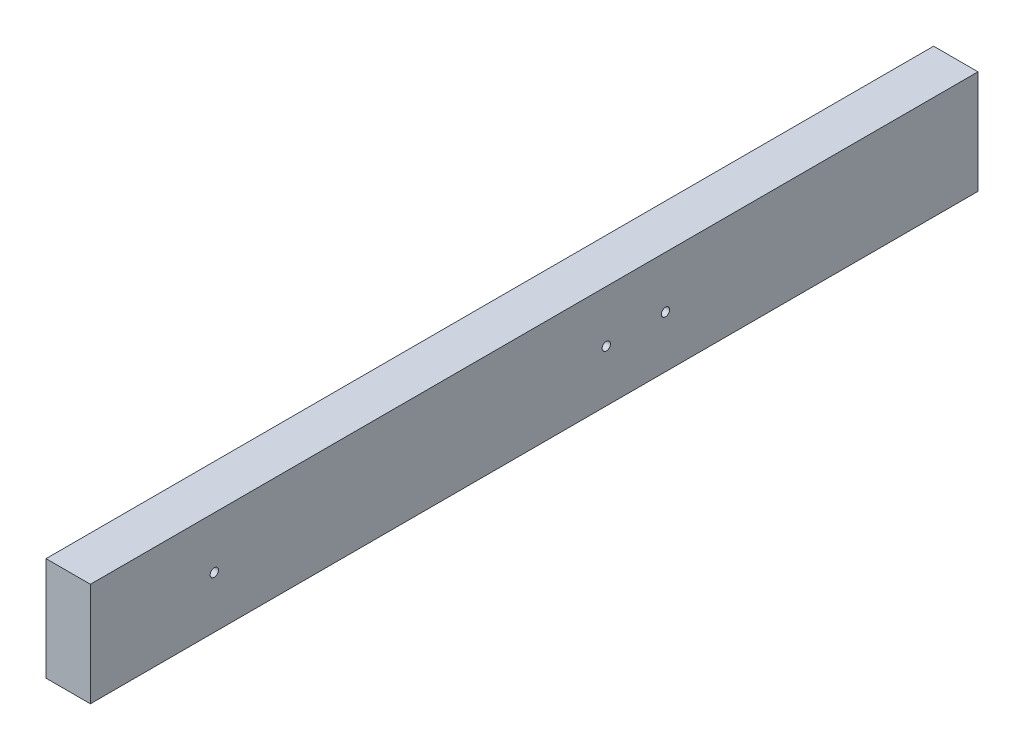
ISO-10303-21;
HEADER;
FILE_DESCRIPTION(('STEP AP214'),'2;1');
FILE_NAME('part.step','',(''),(''),'','','');
FILE_SCHEMA(('AUTOMOTIVE_DESIGN { 1 0 10303 214 1 1 1 1 }'));
ENDSEC;
DATA;
#1=APPLICATION_CONTEXT('core data for automotive mechanical design processes');
#2=APPLICATION_PROTOCOL_DEFINITION('international standard','automotive_design',2000,#1);
#3=PRODUCT_CONTEXT('',#1,'mechanical');
#4=PRODUCT('Part','Part','',(#3));
#5=PRODUCT_RELATED_PRODUCT_CATEGORY('part','',(#4));
#6=PRODUCT_DEFINITION_FORMATION('','',#4);
#7=PRODUCT_DEFINITION_CONTEXT('part definition',#1,'design');
#8=PRODUCT_DEFINITION('design','',#6,#7);
#9=PRODUCT_DEFINITION_SHAPE('','',#8);
#10=(LENGTH_UNIT() NAMED_UNIT(*) SI_UNIT(.MILLI.,.METRE.));
#11=(NAMED_UNIT(*) PLANE_ANGLE_UNIT() SI_UNIT($,.RADIAN.));
#12=(NAMED_UNIT(*) SI_UNIT($,.STERADIAN.) SOLID_ANGLE_UNIT());
#13=UNCERTAINTY_MEASURE_WITH_UNIT(LENGTH_MEASURE(1.E-05),#10,'distance_accuracy_value','');
#14=(GEOMETRIC_REPRESENTATION_CONTEXT(3) GLOBAL_UNCERTAINTY_ASSIGNED_CONTEXT((#13)) GLOBAL_UNIT_ASSIGNED_CONTEXT((#10,
#11,#12)) REPRESENTATION_CONTEXT('',''));
#15=CARTESIAN_POINT('',(0.,0.,0.));
#16=DIRECTION('',(0.,0.,1.));
#17=DIRECTION('',(1.,0.,0.));
#18=AXIS2_PLACEMENT_3D('',#15,#16,#17);
#19=CARTESIAN_POINT('',(38.1,0.,0.));
#20=DIRECTION('',(0.,0.,-1.));
#21=DIRECTION('',(-1.,0.,0.));
#22=AXIS2_PLACEMENT_3D('',#19,#20,#21);
#23=PLANE('',#22);
#24=DIRECTION('',(0.,-1.,0.));
#25=VECTOR('',#24,1.);
#26=CARTESIAN_POINT('',(0.,0.,0.));
#27=LINE('',#26,#25);
#28=CARTESIAN_POINT('',(0.,88.9,0.));
#29=VERTEX_POINT('',#28);
#30=CARTESIAN_POINT('',(0.,0.,0.));
#31=VERTEX_POINT('',#30);
#32=EDGE_CURVE('E95',#29,#31,#27,.T.);
#33=ORIENTED_EDGE('',*,*,#32,.T.);
#34=DIRECTION('',(-1.,0.,0.));
#35=VECTOR('',#34,1.);
#36=CARTESIAN_POINT('',(38.1,0.,0.));
#37=LINE('',#36,#35);
#38=CARTESIAN_POINT('',(38.1,0.,0.));
#39=VERTEX_POINT('',#38);
#40=EDGE_CURVE('E11',#39,#31,#37,.T.);
#41=ORIENTED_EDGE('',*,*,#40,.F.);
#42=DIRECTION('',(0.,-1.,0.));
#43=VECTOR('',#42,1.);
#44=CARTESIAN_POINT('',(38.1,0.,0.));
#45=LINE('',#44,#43);
#46=CARTESIAN_POINT('',(38.1,88.9,0.));
#47=VERTEX_POINT('',#46);
#48=EDGE_CURVE('E83',#47,#39,#45,.T.);
#49=ORIENTED_EDGE('',*,*,#48,.F.);
#50=DIRECTION('',(-1.,0.,0.));
#51=VECTOR('',#50,1.);
#52=CARTESIAN_POINT('',(38.1,88.9,0.));
#53=LINE('',#52,#51);
#54=EDGE_CURVE('E91',#47,#29,#53,.T.);
#55=ORIENTED_EDGE('',*,*,#54,.T.);
#56=EDGE_LOOP('',(#33,#41,#49,#55));
#57=FACE_BOUND('',#56,.T.);
#58=ADVANCED_FACE('F32',(#57),#23,.F.);
#59=CARTESIAN_POINT('',(38.1,0.,0.));
#60=DIRECTION('',(0.,1.,0.));
#61=DIRECTION('',(0.,0.,1.));
#62=AXIS2_PLACEMENT_3D('',#59,#60,#61);
#63=PLANE('',#62);
#64=DIRECTION('',(0.,0.,-1.));
#65=VECTOR('',#64,1.);
#66=CARTESIAN_POINT('',(0.,0.,0.));
#67=LINE('',#66,#65);
#68=CARTESIAN_POINT('',(0.,0.,-762.));
#69=VERTEX_POINT('',#68);
#70=EDGE_CURVE('E87',#31,#69,#67,.T.);
#71=ORIENTED_EDGE('',*,*,#70,.T.);
#72=DIRECTION('',(-1.,0.,0.));
#73=VECTOR('',#72,1.);
#74=CARTESIAN_POINT('',(38.1,0.,-762.));
#75=LINE('',#74,#73);
#76=CARTESIAN_POINT('',(38.1,0.,-762.));
#77=VERTEX_POINT('',#76);
#78=EDGE_CURVE('E40',#77,#69,#75,.T.);
#79=ORIENTED_EDGE('',*,*,#78,.F.);
#80=DIRECTION('',(0.,0.,-1.));
#81=VECTOR('',#80,1.);
#82=CARTESIAN_POINT('',(38.1,0.,0.));
#83=LINE('',#82,#81);
#84=EDGE_CURVE('E78',#39,#77,#83,.T.);
#85=ORIENTED_EDGE('',*,*,#84,.F.);
#86=ORIENTED_EDGE('',*,*,#40,.T.);
#87=EDGE_LOOP('',(#71,#79,#85,#86));
#88=FACE_BOUND('',#87,.T.);
#89=ADVANCED_FACE('F86',(#88),#63,.F.);
#90=CARTESIAN_POINT('',(38.1,0.,-762.));
#91=DIRECTION('',(0.,0.,1.));
#92=DIRECTION('',(1.,0.,0.));
#93=AXIS2_PLACEMENT_3D('',#90,#91,#92);
#94=PLANE('',#93);
#95=DIRECTION('',(0.,1.,0.));
#96=VECTOR('',#95,1.);
#97=CARTESIAN_POINT('',(0.,0.,-762.));
#98=LINE('',#97,#96);
#99=CARTESIAN_POINT('',(0.,88.9,-762.));
#100=VERTEX_POINT('',#99);
#101=EDGE_CURVE('E65',#69,#100,#98,.T.);
#102=ORIENTED_EDGE('',*,*,#101,.T.);
#103=DIRECTION('',(-1.,0.,0.));
#104=VECTOR('',#103,1.);
#105=CARTESIAN_POINT('',(38.1,88.9,-762.));
#106=LINE('',#105,#104);
#107=CARTESIAN_POINT('',(38.1,88.9,-762.));
#108=VERTEX_POINT('',#107);
#109=EDGE_CURVE('E88',#108,#100,#106,.T.);
#110=ORIENTED_EDGE('',*,*,#109,.F.);
#111=DIRECTION('',(0.,1.,0.));
#112=VECTOR('',#111,1.);
#113=CARTESIAN_POINT('',(38.1,0.,-762.));
#114=LINE('',#113,#112);
#115=EDGE_CURVE('E81',#77,#108,#114,.T.);
#116=ORIENTED_EDGE('',*,*,#115,.F.);
#117=ORIENTED_EDGE('',*,*,#78,.T.);
#118=EDGE_LOOP('',(#102,#110,#116,#117));
#119=FACE_BOUND('',#118,.T.);
#120=ADVANCED_FACE('F89',(#119),#94,.F.);
#121=CARTESIAN_POINT('',(38.1,88.9,0.));
#122=DIRECTION('',(0.,-1.,0.));
#123=DIRECTION('',(0.,0.,-1.));
#124=AXIS2_PLACEMENT_3D('',#121,#122,#123);
#125=PLANE('',#124);
#126=DIRECTION('',(0.,0.,1.));
#127=VECTOR('',#126,1.);
#128=CARTESIAN_POINT('',(0.,88.9,0.));
#129=LINE('',#128,#127);
#130=EDGE_CURVE('E71',#100,#29,#129,.T.);
#131=ORIENTED_EDGE('',*,*,#130,.T.);
#132=ORIENTED_EDGE('',*,*,#54,.F.);
#133=DIRECTION('',(0.,0.,1.));
#134=VECTOR('',#133,1.);
#135=CARTESIAN_POINT('',(38.1,88.9,0.));
#136=LINE('',#135,#134);
#137=EDGE_CURVE('E48',#108,#47,#136,.T.);
#138=ORIENTED_EDGE('',*,*,#137,.F.);
#139=ORIENTED_EDGE('',*,*,#109,.T.);
#140=EDGE_LOOP('',(#131,#132,#138,#139));
#141=FACE_BOUND('',#140,.T.);
#142=ADVANCED_FACE('F103',(#141),#125,.F.);
#143=CARTESIAN_POINT('',(38.1,0.,0.));
#144=DIRECTION('',(-1.,0.,0.));
#145=DIRECTION('',(0.,0.,1.));
#146=AXIS2_PLACEMENT_3D('',#143,#144,#145);
#147=PLANE('',#146);
#148=CARTESIAN_POINT('',(38.1,44.45,-106.39298));
#149=DIRECTION('',(1.,0.,0.));
#150=DIRECTION('',(0.,0.,-1.));
#151=AXIS2_PLACEMENT_3D('',#148,#149,#150);
#152=CIRCLE('',#151,3.57187500000001);
#153=CARTESIAN_POINT('',(38.1,44.45,-109.964855));
#154=VERTEX_POINT('',#153);
#155=EDGE_CURVE('E121',#154,#154,#152,.T.);
#156=ORIENTED_EDGE('',*,*,#155,.F.);
#157=EDGE_LOOP('',(#156));
#158=FACE_BOUND('',#157,.T.);
#159=CARTESIAN_POINT('',(38.1,44.45,-442.9125));
#160=DIRECTION('',(1.,0.,0.));
#161=DIRECTION('',(0.,0.,-1.));
#162=AXIS2_PLACEMENT_3D('',#159,#160,#161);
#163=CIRCLE('',#162,3.57187499999998);
#164=CARTESIAN_POINT('',(38.1,44.45,-446.484375));
#165=VERTEX_POINT('',#164);
#166=EDGE_CURVE('E115',#165,#165,#163,.T.);
#167=ORIENTED_EDGE('',*,*,#166,.F.);
#168=EDGE_LOOP('',(#167));
#169=FACE_BOUND('',#168,.T.);
#170=CARTESIAN_POINT('',(38.1,44.45,-493.7125));
#171=DIRECTION('',(1.,0.,0.));
#172=DIRECTION('',(0.,0.,-1.));
#173=AXIS2_PLACEMENT_3D('',#170,#171,#172);
#174=CIRCLE('',#173,3.57187499999998);
#175=CARTESIAN_POINT('',(38.1,44.45,-497.284375));
#176=VERTEX_POINT('',#175);
#177=EDGE_CURVE('E109',#176,#176,#174,.T.);
#178=ORIENTED_EDGE('',*,*,#177,.F.);
#179=EDGE_LOOP('',(#178));
#180=FACE_BOUND('',#179,.T.);
#181=ORIENTED_EDGE('',*,*,#48,.T.);
#182=ORIENTED_EDGE('',*,*,#84,.T.);
#183=ORIENTED_EDGE('',*,*,#115,.T.);
#184=ORIENTED_EDGE('',*,*,#137,.T.);
#185=EDGE_LOOP('',(#181,#182,#183,#184));
#186=FACE_BOUND('',#185,.T.);
#187=ADVANCED_FACE('F79',(#158,#169,#180,#186),#147,.F.);
#188=CARTESIAN_POINT('',(0.,0.,0.));
#189=DIRECTION('',(-1.,0.,0.));
#190=DIRECTION('',(0.,0.,1.));
#191=AXIS2_PLACEMENT_3D('',#188,#189,#190);
#192=PLANE('',#191);
#193=CARTESIAN_POINT('',(0.,44.45,-106.39298));
#194=DIRECTION('',(1.,0.,0.));
#195=DIRECTION('',(0.,0.,-1.));
#196=AXIS2_PLACEMENT_3D('',#193,#194,#195);
#197=CIRCLE('',#196,3.57187500000001);
#198=CARTESIAN_POINT('',(0.,44.45,-109.964855));
#199=VERTEX_POINT('',#198);
#200=EDGE_CURVE('E98',#199,#199,#197,.T.);
#201=ORIENTED_EDGE('',*,*,#200,.T.);
#202=EDGE_LOOP('',(#201));
#203=FACE_BOUND('',#202,.T.);
#204=CARTESIAN_POINT('',(0.,44.45,-442.9125));
#205=DIRECTION('',(1.,0.,0.));
#206=DIRECTION('',(0.,0.,-1.));
#207=AXIS2_PLACEMENT_3D('',#204,#205,#206);
#208=CIRCLE('',#207,3.57187499999998);
#209=CARTESIAN_POINT('',(0.,44.45,-446.484375));
#210=VERTEX_POINT('',#209);
#211=EDGE_CURVE('E118',#210,#210,#208,.T.);
#212=ORIENTED_EDGE('',*,*,#211,.T.);
#213=EDGE_LOOP('',(#212));
#214=FACE_BOUND('',#213,.T.);
#215=CARTESIAN_POINT('',(0.,44.45,-493.7125));
#216=DIRECTION('',(1.,0.,0.));
#217=DIRECTION('',(0.,0.,-1.));
#218=AXIS2_PLACEMENT_3D('',#215,#216,#217);
#219=CIRCLE('',#218,3.57187499999998);
#220=CARTESIAN_POINT('',(0.,44.45,-497.284375));
#221=VERTEX_POINT('',#220);
#222=EDGE_CURVE('E112',#221,#221,#219,.T.);
#223=ORIENTED_EDGE('',*,*,#222,.T.);
#224=EDGE_LOOP('',(#223));
#225=FACE_BOUND('',#224,.T.);
#226=ORIENTED_EDGE('',*,*,#32,.F.);
#227=ORIENTED_EDGE('',*,*,#130,.F.);
#228=ORIENTED_EDGE('',*,*,#101,.F.);
#229=ORIENTED_EDGE('',*,*,#70,.F.);
#230=EDGE_LOOP('',(#226,#227,#228,#229));
#231=FACE_BOUND('',#230,.T.);
#232=ADVANCED_FACE('F106',(#203,#214,#225,#231),#192,.T.);
#233=CARTESIAN_POINT('',(0.,44.45,-493.7125));
#234=DIRECTION('',(1.,0.,0.));
#235=DIRECTION('',(0.,0.,-1.));
#236=AXIS2_PLACEMENT_3D('',#233,#234,#235);
#237=CYLINDRICAL_SURFACE('',#236,3.57187499999998);
#238=CARTESIAN_POINT('',(0.,44.45,-497.284375));
#239=CARTESIAN_POINT('',(0.396875,44.45,-497.284375));
#240=CARTESIAN_POINT('',(0.79375,44.45,-497.284375));
#241=CARTESIAN_POINT('',(1.5875,44.45,-497.284375));
#242=CARTESIAN_POINT('',(1.984375,44.45,-497.284375));
#243=CARTESIAN_POINT('',(2.778125,44.45,-497.284375));
#244=CARTESIAN_POINT('',(3.175,44.45,-497.284375));
#245=CARTESIAN_POINT('',(3.96875,44.45,-497.284375));
#246=CARTESIAN_POINT('',(4.365625,44.45,-497.284375));
#247=CARTESIAN_POINT('',(5.159375,44.45,-497.284375));
#248=CARTESIAN_POINT('',(5.55625,44.45,-497.284375));
#249=CARTESIAN_POINT('',(6.35,44.45,-497.284375));
#250=CARTESIAN_POINT('',(6.746875,44.45,-497.284375));
#251=CARTESIAN_POINT('',(7.540625,44.45,-497.284375));
#252=CARTESIAN_POINT('',(7.9375,44.45,-497.284375));
#253=CARTESIAN_POINT('',(8.73125,44.45,-497.284375));
#254=CARTESIAN_POINT('',(9.128125,44.45,-497.284375));
#255=CARTESIAN_POINT('',(9.921875,44.45,-497.284375));
#256=CARTESIAN_POINT('',(10.31875,44.45,-497.284375));
#257=CARTESIAN_POINT('',(11.1125,44.45,-497.284375));
#258=CARTESIAN_POINT('',(11.509375,44.45,-497.284375));
#259=CARTESIAN_POINT('',(12.303125,44.45,-497.284375));
#260=CARTESIAN_POINT('',(12.7,44.45,-497.284375));
#261=CARTESIAN_POINT('',(13.49375,44.45,-497.284375));
#262=CARTESIAN_POINT('',(13.890625,44.45,-497.284375));
#263=CARTESIAN_POINT('',(14.684375,44.45,-497.284375));
#264=CARTESIAN_POINT('',(15.08125,44.45,-497.284375));
#265=CARTESIAN_POINT('',(15.875,44.45,-497.284375));
#266=CARTESIAN_POINT('',(16.271875,44.45,-497.284375));
#267=CARTESIAN_POINT('',(17.065625,44.45,-497.284375));
#268=CARTESIAN_POINT('',(17.4625,44.45,-497.284375));
#269=CARTESIAN_POINT('',(18.25625,44.45,-497.284375));
#270=CARTESIAN_POINT('',(18.653125,44.45,-497.284375));
#271=CARTESIAN_POINT('',(19.446875,44.45,-497.284375));
#272=CARTESIAN_POINT('',(19.84375,44.45,-497.284375));
#273=CARTESIAN_POINT('',(20.6375,44.45,-497.284375));
#274=CARTESIAN_POINT('',(21.034375,44.45,-497.284375));
#275=CARTESIAN_POINT('',(21.828125,44.45,-497.284375));
#276=CARTESIAN_POINT('',(22.225,44.45,-497.284375));
#277=CARTESIAN_POINT('',(23.01875,44.45,-497.284375));
#278=CARTESIAN_POINT('',(23.415625,44.45,-497.284375));
#279=CARTESIAN_POINT('',(24.209375,44.45,-497.284375));
#280=CARTESIAN_POINT('',(24.60625,44.45,-497.284375));
#281=CARTESIAN_POINT('',(25.4,44.45,-497.284375));
#282=CARTESIAN_POINT('',(25.796875,44.45,-497.284375));
#283=CARTESIAN_POINT('',(26.590625,44.45,-497.284375));
#284=CARTESIAN_POINT('',(26.9875,44.45,-497.284375));
#285=CARTESIAN_POINT('',(27.78125,44.45,-497.284375));
#286=CARTESIAN_POINT('',(28.178125,44.45,-497.284375));
#287=CARTESIAN_POINT('',(28.971875,44.45,-497.284375));
#288=CARTESIAN_POINT('',(29.36875,44.45,-497.284375));
#289=CARTESIAN_POINT('',(30.1625,44.45,-497.284375));
#290=CARTESIAN_POINT('',(30.559375,44.45,-497.284375));
#291=CARTESIAN_POINT('',(31.353125,44.45,-497.284375));
#292=CARTESIAN_POINT('',(31.75,44.45,-497.284375));
#293=CARTESIAN_POINT('',(32.54375,44.45,-497.284375));
#294=CARTESIAN_POINT('',(32.940625,44.45,-497.284375));
#295=CARTESIAN_POINT('',(33.734375,44.45,-497.284375));
#296=CARTESIAN_POINT('',(34.13125,44.45,-497.284375));
#297=CARTESIAN_POINT('',(34.925,44.45,-497.284375));
#298=CARTESIAN_POINT('',(35.321875,44.45,-497.284375));
#299=CARTESIAN_POINT('',(36.115625,44.45,-497.284375));
#300=CARTESIAN_POINT('',(36.5125,44.45,-497.284375));
#301=CARTESIAN_POINT('',(37.30625,44.45,-497.284375));
#302=CARTESIAN_POINT('',(37.703125,44.45,-497.284375));
#303=CARTESIAN_POINT('',(38.1,44.45,-497.284375));
#304=B_SPLINE_CURVE_WITH_KNOTS('',3,(#238,#239,#240,#241,#242,#243,#244,#245,#246,#247,#248,
#249,#250,#251,#252,#253,#254,#255,#256,#257,#258,#259,#260,#261,#262,#263,#264,#265,#266,#267,
#268,#269,#270,#271,#272,#273,#274,#275,#276,#277,#278,#279,#280,#281,#282,#283,#284,#285,#286,
#287,#288,#289,#290,#291,#292,#293,#294,#295,#296,#297,#298,#299,#300,#301,#302,#303),
.UNSPECIFIED.,.F.,.F.,(4,2,2,2,2,2,2,2,2,2,2,2,2,2,2,2,2,2,2,2,2,2,2,2,2,2,2,2,2,2,2,2,4),(0.,
1.190625,2.38125,3.571875,4.7625,5.953125,7.14375,8.334375,9.525,10.715625,11.90625,13.096875,
14.2875,15.478125,16.66875,17.859375,19.05,20.240625,21.43125,22.621875,23.8125,25.003125,
26.19375,27.384375,28.575,29.765625,30.95625,32.146875,33.3375,34.528125,35.71875,36.909375,
38.1),.UNSPECIFIED.);
#305=EDGE_CURVE('BSEAM143',#221,#176,#304,.T.);
#306=ORIENTED_EDGE('',*,*,#222,.F.);
#307=ORIENTED_EDGE('',*,*,#177,.T.);
#308=ORIENTED_EDGE('',*,*,#305,.T.);
#309=ORIENTED_EDGE('',*,*,#305,.F.);
#310=EDGE_LOOP('',(#306,#308,#307,#309));
#311=FACE_BOUND('',#310,.T.);
#312=ADVANCED_FACE('F143',(#311),#237,.F.);
#313=CARTESIAN_POINT('',(0.,44.45,-442.9125));
#314=DIRECTION('',(1.,0.,0.));
#315=DIRECTION('',(0.,0.,-1.));
#316=AXIS2_PLACEMENT_3D('',#313,#314,#315);
#317=CYLINDRICAL_SURFACE('',#316,3.57187499999998);
#318=CARTESIAN_POINT('',(0.,44.45,-446.484375));
#319=CARTESIAN_POINT('',(0.396875,44.45,-446.484375));
#320=CARTESIAN_POINT('',(0.79375,44.45,-446.484375));
#321=CARTESIAN_POINT('',(1.5875,44.45,-446.484375));
#322=CARTESIAN_POINT('',(1.984375,44.45,-446.484375));
#323=CARTESIAN_POINT('',(2.778125,44.45,-446.484375));
#324=CARTESIAN_POINT('',(3.175,44.45,-446.484375));
#325=CARTESIAN_POINT('',(3.96875,44.45,-446.484375));
#326=CARTESIAN_POINT('',(4.365625,44.45,-446.484375));
#327=CARTESIAN_POINT('',(5.159375,44.45,-446.484375));
#328=CARTESIAN_POINT('',(5.55625,44.45,-446.484375));
#329=CARTESIAN_POINT('',(6.35,44.45,-446.484375));
#330=CARTESIAN_POINT('',(6.746875,44.45,-446.484375));
#331=CARTESIAN_POINT('',(7.540625,44.45,-446.484375));
#332=CARTESIAN_POINT('',(7.9375,44.45,-446.484375));
#333=CARTESIAN_POINT('',(8.73125,44.45,-446.484375));
#334=CARTESIAN_POINT('',(9.128125,44.45,-446.484375));
#335=CARTESIAN_POINT('',(9.921875,44.45,-446.484375));
#336=CARTESIAN_POINT('',(10.31875,44.45,-446.484375));
#337=CARTESIAN_POINT('',(11.1125,44.45,-446.484375));
#338=CARTESIAN_POINT('',(11.509375,44.45,-446.484375));
#339=CARTESIAN_POINT('',(12.303125,44.45,-446.484375));
#340=CARTESIAN_POINT('',(12.7,44.45,-446.484375));
#341=CARTESIAN_POINT('',(13.49375,44.45,-446.484375));
#342=CARTESIAN_POINT('',(13.890625,44.45,-446.484375));
#343=CARTESIAN_POINT('',(14.684375,44.45,-446.484375));
#344=CARTESIAN_POINT('',(15.08125,44.45,-446.484375));
#345=CARTESIAN_POINT('',(15.875,44.45,-446.484375));
#346=CARTESIAN_POINT('',(16.271875,44.45,-446.484375));
#347=CARTESIAN_POINT('',(17.065625,44.45,-446.484375));
#348=CARTESIAN_POINT('',(17.4625,44.45,-446.484375));
#349=CARTESIAN_POINT('',(18.25625,44.45,-446.484375));
#350=CARTESIAN_POINT('',(18.653125,44.45,-446.484375));
#351=CARTESIAN_POINT('',(19.446875,44.45,-446.484375));
#352=CARTESIAN_POINT('',(19.84375,44.45,-446.484375));
#353=CARTESIAN_POINT('',(20.6375,44.45,-446.484375));
#354=CARTESIAN_POINT('',(21.034375,44.45,-446.484375));
#355=CARTESIAN_POINT('',(21.828125,44.45,-446.484375));
#356=CARTESIAN_POINT('',(22.225,44.45,-446.484375));
#357=CARTESIAN_POINT('',(23.01875,44.45,-446.484375));
#358=CARTESIAN_POINT('',(23.415625,44.45,-446.484375));
#359=CARTESIAN_POINT('',(24.209375,44.45,-446.484375));
#360=CARTESIAN_POINT('',(24.60625,44.45,-446.484375));
#361=CARTESIAN_POINT('',(25.4,44.45,-446.484375));
#362=CARTESIAN_POINT('',(25.796875,44.45,-446.484375));
#363=CARTESIAN_POINT('',(26.590625,44.45,-446.484375));
#364=CARTESIAN_POINT('',(26.9875,44.45,-446.484375));
#365=CARTESIAN_POINT('',(27.78125,44.45,-446.484375));
#366=CARTESIAN_POINT('',(28.178125,44.45,-446.484375));
#367=CARTESIAN_POINT('',(28.971875,44.45,-446.484375));
#368=CARTESIAN_POINT('',(29.36875,44.45,-446.484375));
#369=CARTESIAN_POINT('',(30.1625,44.45,-446.484375));
#370=CARTESIAN_POINT('',(30.559375,44.45,-446.484375));
#371=CARTESIAN_POINT('',(31.353125,44.45,-446.484375));
#372=CARTESIAN_POINT('',(31.75,44.45,-446.484375));
#373=CARTESIAN_POINT('',(32.54375,44.45,-446.484375));
#374=CARTESIAN_POINT('',(32.940625,44.45,-446.484375));
#375=CARTESIAN_POINT('',(33.734375,44.45,-446.484375));
#376=CARTESIAN_POINT('',(34.13125,44.45,-446.484375));
#377=CARTESIAN_POINT('',(34.925,44.45,-446.484375));
#378=CARTESIAN_POINT('',(35.321875,44.45,-446.484375));
#379=CARTESIAN_POINT('',(36.115625,44.45,-446.484375));
#380=CARTESIAN_POINT('',(36.5125,44.45,-446.484375));
#381=CARTESIAN_POINT('',(37.30625,44.45,-446.484375));
#382=CARTESIAN_POINT('',(37.703125,44.45,-446.484375));
#383=CARTESIAN_POINT('',(38.1,44.45,-446.484375));
#384=B_SPLINE_CURVE_WITH_KNOTS('',3,(#318,#319,#320,#321,#322,#323,#324,#325,#326,#327,#328,
#329,#330,#331,#332,#333,#334,#335,#336,#337,#338,#339,#340,#341,#342,#343,#344,#345,#346,#347,
#348,#349,#350,#351,#352,#353,#354,#355,#356,#357,#358,#359,#360,#361,#362,#363,#364,#365,#366,
#367,#368,#369,#370,#371,#372,#373,#374,#375,#376,#377,#378,#379,#380,#381,#382,#383),
.UNSPECIFIED.,.F.,.F.,(4,2,2,2,2,2,2,2,2,2,2,2,2,2,2,2,2,2,2,2,2,2,2,2,2,2,2,2,2,2,2,2,4),(0.,
1.190625,2.38125,3.571875,4.7625,5.953125,7.14375,8.334375,9.525,10.715625,11.90625,13.096875,
14.2875,15.478125,16.66875,17.859375,19.05,20.240625,21.43125,22.621875,23.8125,25.003125,
26.19375,27.384375,28.575,29.765625,30.95625,32.146875,33.3375,34.528125,35.71875,36.909375,
38.1),.UNSPECIFIED.);
#385=EDGE_CURVE('BSEAM132',#210,#165,#384,.T.);
#386=ORIENTED_EDGE('',*,*,#211,.F.);
#387=ORIENTED_EDGE('',*,*,#166,.T.);
#388=ORIENTED_EDGE('',*,*,#385,.T.);
#389=ORIENTED_EDGE('',*,*,#385,.F.);
#390=EDGE_LOOP('',(#386,#388,#387,#389));
#391=FACE_BOUND('',#390,.T.);
#392=ADVANCED_FACE('F132',(#391),#317,.F.);
#393=CARTESIAN_POINT('',(0.,44.45,-106.39298));
#394=DIRECTION('',(1.,0.,0.));
#395=DIRECTION('',(0.,0.,-1.));
#396=AXIS2_PLACEMENT_3D('',#393,#394,#395);
#397=CYLINDRICAL_SURFACE('',#396,3.57187500000001);
#398=CARTESIAN_POINT('',(0.,44.45,-109.964855));
#399=CARTESIAN_POINT('',(0.396875,44.45,-109.964855));
#400=CARTESIAN_POINT('',(0.79375,44.45,-109.964855));
#401=CARTESIAN_POINT('',(1.5875,44.45,-109.964855));
#402=CARTESIAN_POINT('',(1.984375,44.45,-109.964855));
#403=CARTESIAN_POINT('',(2.778125,44.45,-109.964855));
#404=CARTESIAN_POINT('',(3.175,44.45,-109.964855));
#405=CARTESIAN_POINT('',(3.96875,44.45,-109.964855));
#406=CARTESIAN_POINT('',(4.365625,44.45,-109.964855));
#407=CARTESIAN_POINT('',(5.159375,44.45,-109.964855));
#408=CARTESIAN_POINT('',(5.55625,44.45,-109.964855));
#409=CARTESIAN_POINT('',(6.35,44.45,-109.964855));
#410=CARTESIAN_POINT('',(6.746875,44.45,-109.964855));
#411=CARTESIAN_POINT('',(7.540625,44.45,-109.964855));
#412=CARTESIAN_POINT('',(7.9375,44.45,-109.964855));
#413=CARTESIAN_POINT('',(8.73125,44.45,-109.964855));
#414=CARTESIAN_POINT('',(9.128125,44.45,-109.964855));
#415=CARTESIAN_POINT('',(9.921875,44.45,-109.964855));
#416=CARTESIAN_POINT('',(10.31875,44.45,-109.964855));
#417=CARTESIAN_POINT('',(11.1125,44.45,-109.964855));
#418=CARTESIAN_POINT('',(11.509375,44.45,-109.964855));
#419=CARTESIAN_POINT('',(12.303125,44.45,-109.964855));
#420=CARTESIAN_POINT('',(12.7,44.45,-109.964855));
#421=CARTESIAN_POINT('',(13.49375,44.45,-109.964855));
#422=CARTESIAN_POINT('',(13.890625,44.45,-109.964855));
#423=CARTESIAN_POINT('',(14.684375,44.45,-109.964855));
#424=CARTESIAN_POINT('',(15.08125,44.45,-109.964855));
#425=CARTESIAN_POINT('',(15.875,44.45,-109.964855));
#426=CARTESIAN_POINT('',(16.271875,44.45,-109.964855));
#427=CARTESIAN_POINT('',(17.065625,44.45,-109.964855));
#428=CARTESIAN_POINT('',(17.4625,44.45,-109.964855));
#429=CARTESIAN_POINT('',(18.25625,44.45,-109.964855));
#430=CARTESIAN_POINT('',(18.653125,44.45,-109.964855));
#431=CARTESIAN_POINT('',(19.446875,44.45,-109.964855));
#432=CARTESIAN_POINT('',(19.84375,44.45,-109.964855));
#433=CARTESIAN_POINT('',(20.6375,44.45,-109.964855));
#434=CARTESIAN_POINT('',(21.034375,44.45,-109.964855));
#435=CARTESIAN_POINT('',(21.828125,44.45,-109.964855));
#436=CARTESIAN_POINT('',(22.225,44.45,-109.964855));
#437=CARTESIAN_POINT('',(23.01875,44.45,-109.964855));
#438=CARTESIAN_POINT('',(23.415625,44.45,-109.964855));
#439=CARTESIAN_POINT('',(24.209375,44.45,-109.964855));
#440=CARTESIAN_POINT('',(24.60625,44.45,-109.964855));
#441=CARTESIAN_POINT('',(25.4,44.45,-109.964855));
#442=CARTESIAN_POINT('',(25.796875,44.45,-109.964855));
#443=CARTESIAN_POINT('',(26.590625,44.45,-109.964855));
#444=CARTESIAN_POINT('',(26.9875,44.45,-109.964855));
#445=CARTESIAN_POINT('',(27.78125,44.45,-109.964855));
#446=CARTESIAN_POINT('',(28.178125,44.45,-109.964855));
#447=CARTESIAN_POINT('',(28.971875,44.45,-109.964855));
#448=CARTESIAN_POINT('',(29.36875,44.45,-109.964855));
#449=CARTESIAN_POINT('',(30.1625,44.45,-109.964855));
#450=CARTESIAN_POINT('',(30.559375,44.45,-109.964855));
#451=CARTESIAN_POINT('',(31.353125,44.45,-109.964855));
#452=CARTESIAN_POINT('',(31.75,44.45,-109.964855));
#453=CARTESIAN_POINT('',(32.54375,44.45,-109.964855));
#454=CARTESIAN_POINT('',(32.940625,44.45,-109.964855));
#455=CARTESIAN_POINT('',(33.734375,44.45,-109.964855));
#456=CARTESIAN_POINT('',(34.13125,44.45,-109.964855));
#457=CARTESIAN_POINT('',(34.925,44.45,-109.964855));
#458=CARTESIAN_POINT('',(35.321875,44.45,-109.964855));
#459=CARTESIAN_POINT('',(36.115625,44.45,-109.964855));
#460=CARTESIAN_POINT('',(36.5125,44.45,-109.964855));
#461=CARTESIAN_POINT('',(37.30625,44.45,-109.964855));
#462=CARTESIAN_POINT('',(37.703125,44.45,-109.964855));
#463=CARTESIAN_POINT('',(38.1,44.45,-109.964855));
#464=B_SPLINE_CURVE_WITH_KNOTS('',3,(#398,#399,#400,#401,#402,#403,#404,#405,#406,#407,#408,
#409,#410,#411,#412,#413,#414,#415,#416,#417,#418,#419,#420,#421,#422,#423,#424,#425,#426,#427,
#428,#429,#430,#431,#432,#433,#434,#435,#436,#437,#438,#439,#440,#441,#442,#443,#444,#445,#446,
#447,#448,#449,#450,#451,#452,#453,#454,#455,#456,#457,#458,#459,#460,#461,#462,#463),
.UNSPECIFIED.,.F.,.F.,(4,2,2,2,2,2,2,2,2,2,2,2,2,2,2,2,2,2,2,2,2,2,2,2,2,2,2,2,2,2,2,2,4),(0.,
1.190625,2.38125,3.571875,4.7625,5.953125,7.14375,8.334375,9.525,10.715625,11.90625,13.096875,
14.2875,15.478125,16.66875,17.859375,19.05,20.240625,21.43125,22.621875,23.8125,25.003125,
26.19375,27.384375,28.575,29.765625,30.95625,32.146875,33.3375,34.528125,35.71875,36.909375,
38.1),.UNSPECIFIED.);
#465=EDGE_CURVE('BSEAM129',#199,#154,#464,.T.);
#466=ORIENTED_EDGE('',*,*,#200,.F.);
#467=ORIENTED_EDGE('',*,*,#155,.T.);
#468=ORIENTED_EDGE('',*,*,#465,.T.);
#469=ORIENTED_EDGE('',*,*,#465,.F.);
#470=EDGE_LOOP('',(#466,#468,#467,#469));
#471=FACE_BOUND('',#470,.T.);
#472=ADVANCED_FACE('F129',(#471),#397,.F.);
#473=CLOSED_SHELL('',(#58,#89,#120,#142,#187,#232,#312,#392,#472));
#474=MANIFOLD_SOLID_BREP('B2',#473);
#475=ADVANCED_BREP_SHAPE_REPRESENTATION('',(#18,#474),#14);
#476=SHAPE_DEFINITION_REPRESENTATION(#9,#475);
ENDSEC;
END-ISO-10303-21;
